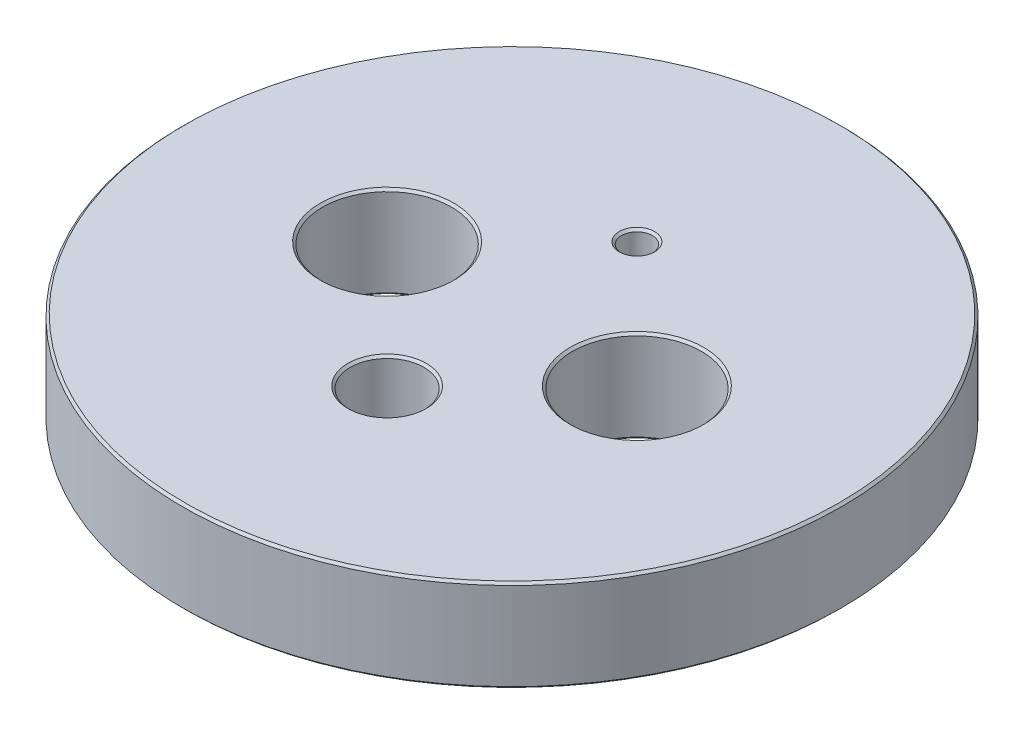
ISO-10303-21;
HEADER;
FILE_DESCRIPTION(('STEP AP214'),'2;1');
FILE_NAME('part.step','',(''),(''),'','','');
FILE_SCHEMA(('AUTOMOTIVE_DESIGN { 1 0 10303 214 1 1 1 1 }'));
ENDSEC;
DATA;
#1=APPLICATION_CONTEXT('core data for automotive mechanical design processes');
#2=APPLICATION_PROTOCOL_DEFINITION('international standard','automotive_design',2000,#1);
#3=PRODUCT_CONTEXT('',#1,'mechanical');
#4=PRODUCT('Part','Part','',(#3));
#5=PRODUCT_RELATED_PRODUCT_CATEGORY('part','',(#4));
#6=PRODUCT_DEFINITION_FORMATION('','',#4);
#7=PRODUCT_DEFINITION_CONTEXT('part definition',#1,'design');
#8=PRODUCT_DEFINITION('design','',#6,#7);
#9=PRODUCT_DEFINITION_SHAPE('','',#8);
#10=(LENGTH_UNIT() NAMED_UNIT(*) SI_UNIT(.MILLI.,.METRE.));
#11=(NAMED_UNIT(*) PLANE_ANGLE_UNIT() SI_UNIT($,.RADIAN.));
#12=(NAMED_UNIT(*) SI_UNIT($,.STERADIAN.) SOLID_ANGLE_UNIT());
#13=UNCERTAINTY_MEASURE_WITH_UNIT(LENGTH_MEASURE(1.E-05),#10,'distance_accuracy_value','');
#14=(GEOMETRIC_REPRESENTATION_CONTEXT(3) GLOBAL_UNCERTAINTY_ASSIGNED_CONTEXT((#13)) GLOBAL_UNIT_ASSIGNED_CONTEXT((#10,
#11,#12)) REPRESENTATION_CONTEXT('',''));
#15=CARTESIAN_POINT('',(0.,0.,0.));
#16=DIRECTION('',(0.,0.,1.));
#17=DIRECTION('',(1.,0.,0.));
#18=AXIS2_PLACEMENT_3D('',#15,#16,#17);
#19=CARTESIAN_POINT('',(0.,-22.625,0.));
#20=DIRECTION('',(0.,-1.,0.));
#21=DIRECTION('',(-1.,0.,0.));
#22=AXIS2_PLACEMENT_3D('',#19,#20,#21);
#23=CONICAL_SURFACE('',#22,35.625,0.785398163397448);
#24=CARTESIAN_POINT('',(0.,-22.75,0.));
#25=DIRECTION('',(0.,1.,0.));
#26=DIRECTION('',(-1.,0.,0.));
#27=AXIS2_PLACEMENT_3D('',#24,#25,#26);
#28=CIRCLE('',#27,35.75);
#29=CARTESIAN_POINT('',(35.75,-22.75,0.));
#30=VERTEX_POINT('',#29);
#31=EDGE_CURVE('E203',#30,#30,#28,.T.);
#32=ORIENTED_EDGE('',*,*,#31,.T.);
#33=DIRECTION('',(-0.707106781186548,0.707106781186548,0.));
#34=VECTOR('',#33,1.);
#35=CARTESIAN_POINT('',(35.625,-22.625,0.));
#36=LINE('',#35,#34);
#37=CARTESIAN_POINT('',(35.5,-22.5,0.));
#38=VERTEX_POINT('',#37);
#39=EDGE_CURVE('E10',#30,#38,#36,.T.);
#40=ORIENTED_EDGE('',*,*,#39,.T.);
#41=CARTESIAN_POINT('',(0.,-22.5,0.));
#42=DIRECTION('',(0.,-1.,0.));
#43=DIRECTION('',(-1.,0.,0.));
#44=AXIS2_PLACEMENT_3D('',#41,#42,#43);
#45=CIRCLE('',#44,35.5);
#46=EDGE_CURVE('E222',#38,#38,#45,.T.);
#47=ORIENTED_EDGE('',*,*,#46,.T.);
#48=ORIENTED_EDGE('',*,*,#39,.F.);
#49=EDGE_LOOP('',(#32,#40,#47,#48));
#50=FACE_BOUND('',#49,.T.);
#51=ADVANCED_FACE('F16',(#50),#23,.T.);
#52=CARTESIAN_POINT('',(0.,-22.625,13.55));
#53=DIRECTION('',(0.,1.,0.));
#54=DIRECTION('',(1.,0.,0.));
#55=AXIS2_PLACEMENT_3D('',#52,#53,#54);
#56=CONICAL_SURFACE('',#55,4.125,0.785398163397451);
#57=CARTESIAN_POINT('',(0.,-22.5,13.55));
#58=DIRECTION('',(0.,1.,0.));
#59=DIRECTION('',(1.,0.,0.));
#60=AXIS2_PLACEMENT_3D('',#57,#58,#59);
#61=CIRCLE('',#60,4.25);
#62=CARTESIAN_POINT('',(-4.25,-22.5,13.55));
#63=VERTEX_POINT('',#62);
#64=EDGE_CURVE('E175',#63,#63,#61,.T.);
#65=ORIENTED_EDGE('',*,*,#64,.T.);
#66=DIRECTION('',(0.707106781186549,-0.707106781186546,0.));
#67=VECTOR('',#66,1.);
#68=CARTESIAN_POINT('',(-4.125,-22.625,13.55));
#69=LINE('',#68,#67);
#70=CARTESIAN_POINT('',(-4.,-22.75,13.55));
#71=VERTEX_POINT('',#70);
#72=EDGE_CURVE('E28',#63,#71,#69,.T.);
#73=ORIENTED_EDGE('',*,*,#72,.T.);
#74=CARTESIAN_POINT('',(0.,-22.75,13.55));
#75=DIRECTION('',(0.,-1.,0.));
#76=DIRECTION('',(1.,0.,0.));
#77=AXIS2_PLACEMENT_3D('',#74,#75,#76);
#78=CIRCLE('',#77,4.);
#79=EDGE_CURVE('E162',#71,#71,#78,.T.);
#80=ORIENTED_EDGE('',*,*,#79,.T.);
#81=ORIENTED_EDGE('',*,*,#72,.F.);
#82=EDGE_LOOP('',(#65,#73,#80,#81));
#83=FACE_BOUND('',#82,.T.);
#84=ADVANCED_FACE('F329',(#83),#56,.F.);
#85=CARTESIAN_POINT('',(-13.55,-22.625,0.));
#86=DIRECTION('',(0.,1.,0.));
#87=DIRECTION('',(1.,0.,0.));
#88=AXIS2_PLACEMENT_3D('',#85,#86,#87);
#89=CONICAL_SURFACE('',#88,7.125,0.785398163397451);
#90=CARTESIAN_POINT('',(-13.55,-22.5,0.));
#91=DIRECTION('',(0.,1.,0.));
#92=DIRECTION('',(1.,0.,0.));
#93=AXIS2_PLACEMENT_3D('',#90,#91,#92);
#94=CIRCLE('',#93,7.25);
#95=CARTESIAN_POINT('',(-20.8,-22.5,0.));
#96=VERTEX_POINT('',#95);
#97=EDGE_CURVE('E204',#96,#96,#94,.T.);
#98=ORIENTED_EDGE('',*,*,#97,.T.);
#99=DIRECTION('',(0.707106781186549,-0.707106781186546,0.));
#100=VECTOR('',#99,1.);
#101=CARTESIAN_POINT('',(-20.675,-22.625,0.));
#102=LINE('',#101,#100);
#103=CARTESIAN_POINT('',(-20.55,-22.75,0.));
#104=VERTEX_POINT('',#103);
#105=EDGE_CURVE('E42',#96,#104,#102,.T.);
#106=ORIENTED_EDGE('',*,*,#105,.T.);
#107=CARTESIAN_POINT('',(-13.55,-22.75,0.));
#108=DIRECTION('',(0.,-1.,0.));
#109=DIRECTION('',(1.,0.,0.));
#110=AXIS2_PLACEMENT_3D('',#107,#108,#109);
#111=CIRCLE('',#110,7.);
#112=EDGE_CURVE('E177',#104,#104,#111,.T.);
#113=ORIENTED_EDGE('',*,*,#112,.T.);
#114=ORIENTED_EDGE('',*,*,#105,.F.);
#115=EDGE_LOOP('',(#98,#106,#113,#114));
#116=FACE_BOUND('',#115,.T.);
#117=ADVANCED_FACE('F333',(#116),#89,.F.);
#118=CARTESIAN_POINT('',(13.55,-22.625,0.));
#119=DIRECTION('',(0.,1.,0.));
#120=DIRECTION('',(1.,0.,0.));
#121=AXIS2_PLACEMENT_3D('',#118,#119,#120);
#122=CONICAL_SURFACE('',#121,7.125,0.785398163397448);
#123=CARTESIAN_POINT('',(13.55,-22.5,0.));
#124=DIRECTION('',(0.,1.,0.));
#125=DIRECTION('',(1.,0.,0.));
#126=AXIS2_PLACEMENT_3D('',#123,#124,#125);
#127=CIRCLE('',#126,7.25);
#128=CARTESIAN_POINT('',(6.3,-22.5,0.));
#129=VERTEX_POINT('',#128);
#130=EDGE_CURVE('E228',#129,#129,#127,.T.);
#131=ORIENTED_EDGE('',*,*,#130,.T.);
#132=DIRECTION('',(0.707106781186548,-0.707106781186548,0.));
#133=VECTOR('',#132,1.);
#134=CARTESIAN_POINT('',(6.425,-22.625,0.));
#135=LINE('',#134,#133);
#136=CARTESIAN_POINT('',(6.55,-22.75,0.));
#137=VERTEX_POINT('',#136);
#138=EDGE_CURVE('E207',#129,#137,#135,.T.);
#139=ORIENTED_EDGE('',*,*,#138,.T.);
#140=CARTESIAN_POINT('',(13.55,-22.75,0.));
#141=DIRECTION('',(0.,-1.,0.));
#142=DIRECTION('',(1.,0.,0.));
#143=AXIS2_PLACEMENT_3D('',#140,#141,#142);
#144=CIRCLE('',#143,7.);
#145=EDGE_CURVE('E200',#137,#137,#144,.T.);
#146=ORIENTED_EDGE('',*,*,#145,.T.);
#147=ORIENTED_EDGE('',*,*,#138,.F.);
#148=EDGE_LOOP('',(#131,#139,#146,#147));
#149=FACE_BOUND('',#148,.T.);
#150=ADVANCED_FACE('F508',(#149),#122,.F.);
#151=CARTESIAN_POINT('',(0.,-22.5,0.));
#152=DIRECTION('',(0.,-1.,0.));
#153=DIRECTION('',(0.,0.,-1.));
#154=AXIS2_PLACEMENT_3D('',#151,#152,#153);
#155=PLANE('',#154);
#156=CARTESIAN_POINT('',(0.,-22.5,-13.55));
#157=DIRECTION('',(0.,1.,0.));
#158=DIRECTION('',(1.,0.,0.));
#159=AXIS2_PLACEMENT_3D('',#156,#157,#158);
#160=CIRCLE('',#159,1.916);
#161=CARTESIAN_POINT('',(-1.916,-22.5,-13.55));
#162=VERTEX_POINT('',#161);
#163=EDGE_CURVE('E223',#162,#162,#160,.T.);
#164=ORIENTED_EDGE('',*,*,#163,.F.);
#165=EDGE_LOOP('',(#164));
#166=FACE_BOUND('',#165,.T.);
#167=ORIENTED_EDGE('',*,*,#97,.F.);
#168=EDGE_LOOP('',(#167));
#169=FACE_BOUND('',#168,.T.);
#170=ORIENTED_EDGE('',*,*,#64,.F.);
#171=EDGE_LOOP('',(#170));
#172=FACE_BOUND('',#171,.T.);
#173=ORIENTED_EDGE('',*,*,#130,.F.);
#174=EDGE_LOOP('',(#173));
#175=FACE_BOUND('',#174,.T.);
#176=ORIENTED_EDGE('',*,*,#46,.F.);
#177=EDGE_LOOP('',(#176));
#178=FACE_BOUND('',#177,.T.);
#179=ADVANCED_FACE('F497',(#166,#169,#172,#175,#178),#155,.F.);
#180=CARTESIAN_POINT('',(0.,-22.625,-13.55));
#181=DIRECTION('',(0.,1.,0.));
#182=DIRECTION('',(1.,0.,0.));
#183=AXIS2_PLACEMENT_3D('',#180,#181,#182);
#184=CONICAL_SURFACE('',#183,1.791,0.78539816339745);
#185=ORIENTED_EDGE('',*,*,#163,.T.);
#186=DIRECTION('',(0.707106781186549,-0.707106781186546,0.));
#187=VECTOR('',#186,1.);
#188=CARTESIAN_POINT('',(-1.791,-22.625,-13.55));
#189=LINE('',#188,#187);
#190=CARTESIAN_POINT('',(-1.666,-22.75,-13.55));
#191=VERTEX_POINT('',#190);
#192=EDGE_CURVE('E129',#162,#191,#189,.T.);
#193=ORIENTED_EDGE('',*,*,#192,.T.);
#194=CARTESIAN_POINT('',(0.,-22.75,-13.55));
#195=DIRECTION('',(0.,-1.,0.));
#196=DIRECTION('',(1.,0.,0.));
#197=AXIS2_PLACEMENT_3D('',#194,#195,#196);
#198=CIRCLE('',#197,1.666);
#199=EDGE_CURVE('E239',#191,#191,#198,.T.);
#200=ORIENTED_EDGE('',*,*,#199,.T.);
#201=ORIENTED_EDGE('',*,*,#192,.F.);
#202=EDGE_LOOP('',(#185,#193,#200,#201));
#203=FACE_BOUND('',#202,.T.);
#204=ADVANCED_FACE('F381',(#203),#184,.F.);
#205=CARTESIAN_POINT('',(0.,-22.5,0.));
#206=DIRECTION('',(0.,-1.,0.));
#207=DIRECTION('',(-1.,0.,0.));
#208=AXIS2_PLACEMENT_3D('',#205,#206,#207);
#209=CYLINDRICAL_SURFACE('',#208,35.75);
#210=CARTESIAN_POINT('',(0.,-32.25,0.));
#211=DIRECTION('',(0.,-1.,0.));
#212=DIRECTION('',(-1.,0.,0.));
#213=AXIS2_PLACEMENT_3D('',#210,#211,#212);
#214=CIRCLE('',#213,35.75);
#215=CARTESIAN_POINT('',(35.75,-32.25,0.));
#216=VERTEX_POINT('',#215);
#217=EDGE_CURVE('E199',#216,#216,#214,.T.);
#218=ORIENTED_EDGE('',*,*,#217,.F.);
#219=DIRECTION('',(0.,1.,0.));
#220=VECTOR('',#219,1.);
#221=CARTESIAN_POINT('',(35.75,-22.5,0.));
#222=LINE('',#221,#220);
#223=EDGE_CURVE('E113',#216,#30,#222,.T.);
#224=ORIENTED_EDGE('',*,*,#223,.T.);
#225=ORIENTED_EDGE('',*,*,#31,.F.);
#226=ORIENTED_EDGE('',*,*,#223,.F.);
#227=EDGE_LOOP('',(#218,#224,#225,#226));
#228=FACE_BOUND('',#227,.T.);
#229=ADVANCED_FACE('F366',(#228),#209,.T.);
#230=CARTESIAN_POINT('',(0.,-32.375,0.));
#231=DIRECTION('',(0.,1.,0.));
#232=DIRECTION('',(-1.,0.,0.));
#233=AXIS2_PLACEMENT_3D('',#230,#231,#232);
#234=CONICAL_SURFACE('',#233,35.625,0.785398163397448);
#235=CARTESIAN_POINT('',(0.,-32.5,0.));
#236=DIRECTION('',(0.,1.,0.));
#237=DIRECTION('',(-1.,0.,0.));
#238=AXIS2_PLACEMENT_3D('',#235,#236,#237);
#239=CIRCLE('',#238,35.5);
#240=CARTESIAN_POINT('',(35.5,-32.5,0.));
#241=VERTEX_POINT('',#240);
#242=EDGE_CURVE('E189',#241,#241,#239,.T.);
#243=ORIENTED_EDGE('',*,*,#242,.T.);
#244=DIRECTION('',(0.707106781186548,0.707106781186548,0.));
#245=VECTOR('',#244,1.);
#246=CARTESIAN_POINT('',(35.625,-32.375,0.));
#247=LINE('',#246,#245);
#248=EDGE_CURVE('E195',#241,#216,#247,.T.);
#249=ORIENTED_EDGE('',*,*,#248,.T.);
#250=ORIENTED_EDGE('',*,*,#217,.T.);
#251=ORIENTED_EDGE('',*,*,#248,.F.);
#252=EDGE_LOOP('',(#243,#249,#250,#251));
#253=FACE_BOUND('',#252,.T.);
#254=ADVANCED_FACE('F374',(#253),#234,.T.);
#255=CARTESIAN_POINT('',(13.55,-32.5,0.));
#256=DIRECTION('',(0.,1.,0.));
#257=DIRECTION('',(1.,0.,0.));
#258=AXIS2_PLACEMENT_3D('',#255,#256,#257);
#259=CYLINDRICAL_SURFACE('',#258,7.);
#260=CARTESIAN_POINT('',(13.55,-32.25,0.));
#261=DIRECTION('',(0.,1.,0.));
#262=DIRECTION('',(1.,0.,0.));
#263=AXIS2_PLACEMENT_3D('',#260,#261,#262);
#264=CIRCLE('',#263,7.);
#265=CARTESIAN_POINT('',(6.55,-32.25,0.));
#266=VERTEX_POINT('',#265);
#267=EDGE_CURVE('E190',#266,#266,#264,.T.);
#268=ORIENTED_EDGE('',*,*,#267,.F.);
#269=DIRECTION('',(0.,1.,0.));
#270=VECTOR('',#269,1.);
#271=CARTESIAN_POINT('',(6.55,-32.5,0.));
#272=LINE('',#271,#270);
#273=EDGE_CURVE('E194',#266,#137,#272,.T.);
#274=ORIENTED_EDGE('',*,*,#273,.T.);
#275=ORIENTED_EDGE('',*,*,#145,.F.);
#276=ORIENTED_EDGE('',*,*,#273,.F.);
#277=EDGE_LOOP('',(#268,#274,#275,#276));
#278=FACE_BOUND('',#277,.T.);
#279=ADVANCED_FACE('F351',(#278),#259,.F.);
#280=CARTESIAN_POINT('',(13.55,-32.375,0.));
#281=DIRECTION('',(0.,-1.,0.));
#282=DIRECTION('',(1.,0.,0.));
#283=AXIS2_PLACEMENT_3D('',#280,#281,#282);
#284=CONICAL_SURFACE('',#283,7.125,0.785398163397448);
#285=CARTESIAN_POINT('',(13.55,-32.5,0.));
#286=DIRECTION('',(0.,-1.,0.));
#287=DIRECTION('',(1.,0.,0.));
#288=AXIS2_PLACEMENT_3D('',#285,#286,#287);
#289=CIRCLE('',#288,7.25);
#290=CARTESIAN_POINT('',(6.3,-32.5,0.));
#291=VERTEX_POINT('',#290);
#292=EDGE_CURVE('E188',#291,#291,#289,.T.);
#293=ORIENTED_EDGE('',*,*,#292,.T.);
#294=DIRECTION('',(0.707106781186548,0.707106781186548,0.));
#295=VECTOR('',#294,1.);
#296=CARTESIAN_POINT('',(6.425,-32.375,0.));
#297=LINE('',#296,#295);
#298=EDGE_CURVE('E184',#291,#266,#297,.T.);
#299=ORIENTED_EDGE('',*,*,#298,.T.);
#300=ORIENTED_EDGE('',*,*,#267,.T.);
#301=ORIENTED_EDGE('',*,*,#298,.F.);
#302=EDGE_LOOP('',(#293,#299,#300,#301));
#303=FACE_BOUND('',#302,.T.);
#304=ADVANCED_FACE('F347',(#303),#284,.F.);
#305=CARTESIAN_POINT('',(0.,-32.5,-13.55));
#306=DIRECTION('',(0.,1.,0.));
#307=DIRECTION('',(1.,0.,0.));
#308=AXIS2_PLACEMENT_3D('',#305,#306,#307);
#309=CYLINDRICAL_SURFACE('',#308,4.);
#310=CARTESIAN_POINT('',(0.,-32.25,-13.55));
#311=DIRECTION('',(0.,1.,0.));
#312=DIRECTION('',(1.,0.,0.));
#313=AXIS2_PLACEMENT_3D('',#310,#311,#312);
#314=CIRCLE('',#313,4.);
#315=CARTESIAN_POINT('',(-4.,-32.25,-13.55));
#316=VERTEX_POINT('',#315);
#317=EDGE_CURVE('E185',#316,#316,#314,.T.);
#318=ORIENTED_EDGE('',*,*,#317,.F.);
#319=DIRECTION('',(0.,1.,0.));
#320=VECTOR('',#319,1.);
#321=CARTESIAN_POINT('',(-4.,-32.5,-13.55));
#322=LINE('',#321,#320);
#323=CARTESIAN_POINT('',(-4.,-26.5,-13.55));
#324=VERTEX_POINT('',#323);
#325=EDGE_CURVE('E181',#316,#324,#322,.T.);
#326=ORIENTED_EDGE('',*,*,#325,.T.);
#327=CARTESIAN_POINT('',(0.,-26.5,-13.55));
#328=DIRECTION('',(0.,1.,0.));
#329=DIRECTION('',(1.,0.,0.));
#330=AXIS2_PLACEMENT_3D('',#327,#328,#329);
#331=CIRCLE('',#330,4.);
#332=EDGE_CURVE('E242',#324,#324,#331,.T.);
#333=ORIENTED_EDGE('',*,*,#332,.T.);
#334=ORIENTED_EDGE('',*,*,#325,.F.);
#335=EDGE_LOOP('',(#318,#326,#333,#334));
#336=FACE_BOUND('',#335,.T.);
#337=ADVANCED_FACE('F308',(#336),#309,.F.);
#338=CARTESIAN_POINT('',(0.,-32.375,-13.55));
#339=DIRECTION('',(0.,-1.,0.));
#340=DIRECTION('',(1.,0.,0.));
#341=AXIS2_PLACEMENT_3D('',#338,#339,#340);
#342=CONICAL_SURFACE('',#341,4.125,0.785398163397451);
#343=CARTESIAN_POINT('',(0.,-32.5,-13.55));
#344=DIRECTION('',(0.,-1.,0.));
#345=DIRECTION('',(1.,0.,0.));
#346=AXIS2_PLACEMENT_3D('',#343,#344,#345);
#347=CIRCLE('',#346,4.25);
#348=CARTESIAN_POINT('',(-4.25,-32.5,-13.55));
#349=VERTEX_POINT('',#348);
#350=EDGE_CURVE('E219',#349,#349,#347,.T.);
#351=ORIENTED_EDGE('',*,*,#350,.T.);
#352=DIRECTION('',(0.707106781186549,0.707106781186546,0.));
#353=VECTOR('',#352,1.);
#354=CARTESIAN_POINT('',(-4.125,-32.375,-13.55));
#355=LINE('',#354,#353);
#356=EDGE_CURVE('E180',#349,#316,#355,.T.);
#357=ORIENTED_EDGE('',*,*,#356,.T.);
#358=ORIENTED_EDGE('',*,*,#317,.T.);
#359=ORIENTED_EDGE('',*,*,#356,.F.);
#360=EDGE_LOOP('',(#351,#357,#358,#359));
#361=FACE_BOUND('',#360,.T.);
#362=ADVANCED_FACE('F19',(#361),#342,.F.);
#363=CARTESIAN_POINT('',(-13.55,-32.5,0.));
#364=DIRECTION('',(0.,1.,0.));
#365=DIRECTION('',(1.,0.,0.));
#366=AXIS2_PLACEMENT_3D('',#363,#364,#365);
#367=CYLINDRICAL_SURFACE('',#366,7.);
#368=CARTESIAN_POINT('',(-13.55,-32.25,0.));
#369=DIRECTION('',(0.,1.,0.));
#370=DIRECTION('',(1.,0.,0.));
#371=AXIS2_PLACEMENT_3D('',#368,#369,#370);
#372=CIRCLE('',#371,7.);
#373=CARTESIAN_POINT('',(-20.55,-32.25,0.));
#374=VERTEX_POINT('',#373);
#375=EDGE_CURVE('E160',#374,#374,#372,.T.);
#376=ORIENTED_EDGE('',*,*,#375,.F.);
#377=DIRECTION('',(0.,1.,0.));
#378=VECTOR('',#377,1.);
#379=CARTESIAN_POINT('',(-20.55,-32.5,0.));
#380=LINE('',#379,#378);
#381=EDGE_CURVE('E21',#374,#104,#380,.T.);
#382=ORIENTED_EDGE('',*,*,#381,.T.);
#383=ORIENTED_EDGE('',*,*,#112,.F.);
#384=ORIENTED_EDGE('',*,*,#381,.F.);
#385=EDGE_LOOP('',(#376,#382,#383,#384));
#386=FACE_BOUND('',#385,.T.);
#387=ADVANCED_FACE('F369',(#386),#367,.F.);
#388=CARTESIAN_POINT('',(-13.55,-32.375,0.));
#389=DIRECTION('',(0.,-1.,0.));
#390=DIRECTION('',(1.,0.,0.));
#391=AXIS2_PLACEMENT_3D('',#388,#389,#390);
#392=CONICAL_SURFACE('',#391,7.125,0.785398163397451);
#393=CARTESIAN_POINT('',(-13.55,-32.5,0.));
#394=DIRECTION('',(0.,-1.,0.));
#395=DIRECTION('',(1.,0.,0.));
#396=AXIS2_PLACEMENT_3D('',#393,#394,#395);
#397=CIRCLE('',#396,7.25);
#398=CARTESIAN_POINT('',(-20.8,-32.5,0.));
#399=VERTEX_POINT('',#398);
#400=EDGE_CURVE('E159',#399,#399,#397,.T.);
#401=ORIENTED_EDGE('',*,*,#400,.T.);
#402=DIRECTION('',(0.707106781186549,0.707106781186546,0.));
#403=VECTOR('',#402,1.);
#404=CARTESIAN_POINT('',(-20.675,-32.375,0.));
#405=LINE('',#404,#403);
#406=EDGE_CURVE('E156',#399,#374,#405,.T.);
#407=ORIENTED_EDGE('',*,*,#406,.T.);
#408=ORIENTED_EDGE('',*,*,#375,.T.);
#409=ORIENTED_EDGE('',*,*,#406,.F.);
#410=EDGE_LOOP('',(#401,#407,#408,#409));
#411=FACE_BOUND('',#410,.T.);
#412=ADVANCED_FACE('F157',(#411),#392,.F.);
#413=CARTESIAN_POINT('',(0.,-32.5,13.55));
#414=DIRECTION('',(0.,1.,0.));
#415=DIRECTION('',(1.,0.,0.));
#416=AXIS2_PLACEMENT_3D('',#413,#414,#415);
#417=CYLINDRICAL_SURFACE('',#416,4.);
#418=CARTESIAN_POINT('',(0.,-32.25,13.55));
#419=DIRECTION('',(0.,1.,0.));
#420=DIRECTION('',(1.,0.,0.));
#421=AXIS2_PLACEMENT_3D('',#418,#419,#420);
#422=CIRCLE('',#421,4.);
#423=CARTESIAN_POINT('',(-4.,-32.25,13.55));
#424=VERTEX_POINT('',#423);
#425=EDGE_CURVE('E253',#424,#424,#422,.T.);
#426=ORIENTED_EDGE('',*,*,#425,.F.);
#427=DIRECTION('',(0.,1.,0.));
#428=VECTOR('',#427,1.);
#429=CARTESIAN_POINT('',(-4.,-32.5,13.55));
#430=LINE('',#429,#428);
#431=EDGE_CURVE('E171',#424,#71,#430,.T.);
#432=ORIENTED_EDGE('',*,*,#431,.T.);
#433=ORIENTED_EDGE('',*,*,#79,.F.);
#434=ORIENTED_EDGE('',*,*,#431,.F.);
#435=EDGE_LOOP('',(#426,#432,#433,#434));
#436=FACE_BOUND('',#435,.T.);
#437=ADVANCED_FACE('F340',(#436),#417,.F.);
#438=CARTESIAN_POINT('',(0.,-32.5,0.));
#439=DIRECTION('',(0.,-1.,0.));
#440=DIRECTION('',(0.,0.,-1.));
#441=AXIS2_PLACEMENT_3D('',#438,#439,#440);
#442=PLANE('',#441);
#443=CARTESIAN_POINT('',(0.,-32.5,13.55));
#444=DIRECTION('',(0.,-1.,0.));
#445=DIRECTION('',(1.,0.,0.));
#446=AXIS2_PLACEMENT_3D('',#443,#444,#445);
#447=CIRCLE('',#446,4.25);
#448=CARTESIAN_POINT('',(-4.25,-32.5,13.55));
#449=VERTEX_POINT('',#448);
#450=EDGE_CURVE('E287',#449,#449,#447,.T.);
#451=ORIENTED_EDGE('',*,*,#450,.F.);
#452=EDGE_LOOP('',(#451));
#453=FACE_BOUND('',#452,.T.);
#454=ORIENTED_EDGE('',*,*,#350,.F.);
#455=EDGE_LOOP('',(#454));
#456=FACE_BOUND('',#455,.T.);
#457=ORIENTED_EDGE('',*,*,#292,.F.);
#458=EDGE_LOOP('',(#457));
#459=FACE_BOUND('',#458,.T.);
#460=ORIENTED_EDGE('',*,*,#400,.F.);
#461=EDGE_LOOP('',(#460));
#462=FACE_BOUND('',#461,.T.);
#463=ORIENTED_EDGE('',*,*,#242,.F.);
#464=EDGE_LOOP('',(#463));
#465=FACE_BOUND('',#464,.T.);
#466=ADVANCED_FACE('F323',(#453,#456,#459,#462,#465),#442,.T.);
#467=CARTESIAN_POINT('',(0.,-32.375,13.55));
#468=DIRECTION('',(0.,-1.,0.));
#469=DIRECTION('',(1.,0.,0.));
#470=AXIS2_PLACEMENT_3D('',#467,#468,#469);
#471=CONICAL_SURFACE('',#470,4.125,0.785398163397451);
#472=ORIENTED_EDGE('',*,*,#450,.T.);
#473=DIRECTION('',(0.707106781186549,0.707106781186546,0.));
#474=VECTOR('',#473,1.);
#475=CARTESIAN_POINT('',(-4.125,-32.375,13.55));
#476=LINE('',#475,#474);
#477=EDGE_CURVE('E291',#449,#424,#476,.T.);
#478=ORIENTED_EDGE('',*,*,#477,.T.);
#479=ORIENTED_EDGE('',*,*,#425,.T.);
#480=ORIENTED_EDGE('',*,*,#477,.F.);
#481=EDGE_LOOP('',(#472,#478,#479,#480));
#482=FACE_BOUND('',#481,.T.);
#483=ADVANCED_FACE('F313',(#482),#471,.F.);
#484=CARTESIAN_POINT('',(0.,-26.5,-13.55));
#485=DIRECTION('',(0.,-1.,0.));
#486=DIRECTION('',(0.,0.,-1.));
#487=AXIS2_PLACEMENT_3D('',#484,#485,#486);
#488=PLANE('',#487);
#489=CARTESIAN_POINT('',(0.,-26.5,-13.55));
#490=DIRECTION('',(0.,-1.,0.));
#491=DIRECTION('',(1.,0.,0.));
#492=AXIS2_PLACEMENT_3D('',#489,#490,#491);
#493=CIRCLE('',#492,1.916);
#494=CARTESIAN_POINT('',(-1.916,-26.5,-13.55));
#495=VERTEX_POINT('',#494);
#496=EDGE_CURVE('E140',#495,#495,#493,.T.);
#497=ORIENTED_EDGE('',*,*,#496,.F.);
#498=EDGE_LOOP('',(#497));
#499=FACE_BOUND('',#498,.T.);
#500=ORIENTED_EDGE('',*,*,#332,.F.);
#501=EDGE_LOOP('',(#500));
#502=FACE_BOUND('',#501,.T.);
#503=ADVANCED_FACE('F310',(#499,#502),#488,.T.);
#504=CARTESIAN_POINT('',(0.,-32.5,-13.55));
#505=DIRECTION('',(0.,1.,0.));
#506=DIRECTION('',(1.,0.,0.));
#507=AXIS2_PLACEMENT_3D('',#504,#505,#506);
#508=CYLINDRICAL_SURFACE('',#507,1.666);
#509=CARTESIAN_POINT('',(0.,-26.25,-13.55));
#510=DIRECTION('',(0.,1.,0.));
#511=DIRECTION('',(1.,0.,0.));
#512=AXIS2_PLACEMENT_3D('',#509,#510,#511);
#513=CIRCLE('',#512,1.666);
#514=CARTESIAN_POINT('',(-1.666,-26.25,-13.55));
#515=VERTEX_POINT('',#514);
#516=EDGE_CURVE('E272',#515,#515,#513,.T.);
#517=ORIENTED_EDGE('',*,*,#516,.F.);
#518=DIRECTION('',(0.,1.,0.));
#519=VECTOR('',#518,1.);
#520=CARTESIAN_POINT('',(-1.666,-32.5,-13.55));
#521=LINE('',#520,#519);
#522=EDGE_CURVE('E243',#515,#191,#521,.T.);
#523=ORIENTED_EDGE('',*,*,#522,.T.);
#524=ORIENTED_EDGE('',*,*,#199,.F.);
#525=ORIENTED_EDGE('',*,*,#522,.F.);
#526=EDGE_LOOP('',(#517,#523,#524,#525));
#527=FACE_BOUND('',#526,.T.);
#528=ADVANCED_FACE('F312',(#527),#508,.F.);
#529=CARTESIAN_POINT('',(0.,-26.375,-13.55));
#530=DIRECTION('',(0.,-1.,0.));
#531=DIRECTION('',(1.,0.,0.));
#532=AXIS2_PLACEMENT_3D('',#529,#530,#531);
#533=CONICAL_SURFACE('',#532,1.791,0.78539816339745);
#534=ORIENTED_EDGE('',*,*,#516,.T.);
#535=DIRECTION('',(-0.707106781186549,-0.707106781186546,0.));
#536=VECTOR('',#535,1.);
#537=CARTESIAN_POINT('',(-1.791,-26.375,-13.55));
#538=LINE('',#537,#536);
#539=EDGE_CURVE('E269',#515,#495,#538,.T.);
#540=ORIENTED_EDGE('',*,*,#539,.T.);
#541=ORIENTED_EDGE('',*,*,#496,.T.);
#542=ORIENTED_EDGE('',*,*,#539,.F.);
#543=EDGE_LOOP('',(#534,#540,#541,#542));
#544=FACE_BOUND('',#543,.T.);
#545=ADVANCED_FACE('F320',(#544),#533,.F.);
#546=CLOSED_SHELL('',(#51,#84,#117,#150,#179,#204,#229,#254,#279,#304,#337,#362,#387,#412,#437,
#466,#483,#503,#528,#545));
#547=MANIFOLD_SOLID_BREP('B1',#546);
#548=ADVANCED_BREP_SHAPE_REPRESENTATION('',(#18,#547),#14);
#549=SHAPE_DEFINITION_REPRESENTATION(#9,#548);
ENDSEC;
END-ISO-10303-21;
